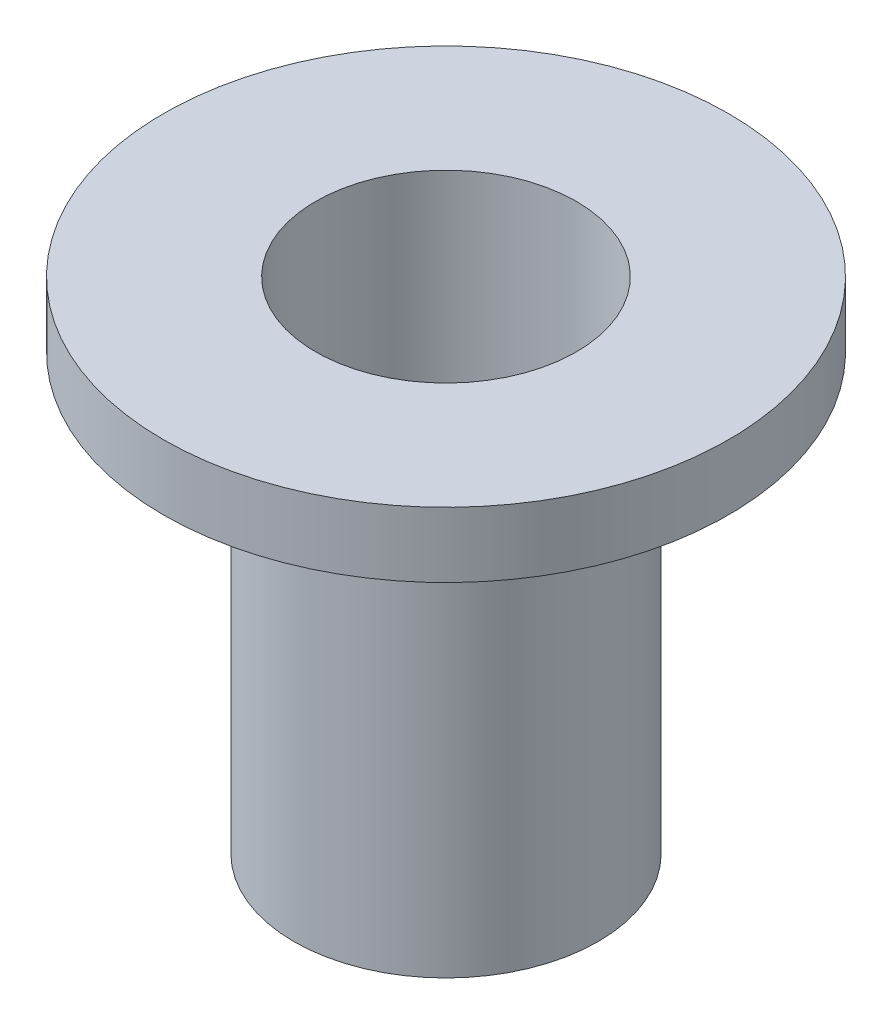
ISO-10303-21;
HEADER;
FILE_DESCRIPTION(('STEP AP214'),'2;1');
FILE_NAME('part.step','',(''),(''),'','','');
FILE_SCHEMA(('AUTOMOTIVE_DESIGN { 1 0 10303 214 1 1 1 1 }'));
ENDSEC;
DATA;
#1=APPLICATION_CONTEXT('core data for automotive mechanical design processes');
#2=APPLICATION_PROTOCOL_DEFINITION('international standard','automotive_design',2000,#1);
#3=PRODUCT_CONTEXT('',#1,'mechanical');
#4=PRODUCT('Part','Part','',(#3));
#5=PRODUCT_RELATED_PRODUCT_CATEGORY('part','',(#4));
#6=PRODUCT_DEFINITION_FORMATION('','',#4);
#7=PRODUCT_DEFINITION_CONTEXT('part definition',#1,'design');
#8=PRODUCT_DEFINITION('design','',#6,#7);
#9=PRODUCT_DEFINITION_SHAPE('','',#8);
#10=(LENGTH_UNIT() NAMED_UNIT(*) SI_UNIT(.MILLI.,.METRE.));
#11=(NAMED_UNIT(*) PLANE_ANGLE_UNIT() SI_UNIT($,.RADIAN.));
#12=(NAMED_UNIT(*) SI_UNIT($,.STERADIAN.) SOLID_ANGLE_UNIT());
#13=UNCERTAINTY_MEASURE_WITH_UNIT(LENGTH_MEASURE(1.E-05),#10,'distance_accuracy_value','');
#14=(GEOMETRIC_REPRESENTATION_CONTEXT(3) GLOBAL_UNCERTAINTY_ASSIGNED_CONTEXT((#13)) GLOBAL_UNIT_ASSIGNED_CONTEXT((#10,
#11,#12)) REPRESENTATION_CONTEXT('',''));
#15=CARTESIAN_POINT('',(0.,0.,0.));
#16=DIRECTION('',(0.,0.,1.));
#17=DIRECTION('',(1.,0.,0.));
#18=AXIS2_PLACEMENT_3D('',#15,#16,#17);
#19=CARTESIAN_POINT('',(0.,0.,0.));
#20=DIRECTION('',(0.,-1.,0.));
#21=DIRECTION('',(0.,0.,-1.));
#22=AXIS2_PLACEMENT_3D('',#19,#20,#21);
#23=CYLINDRICAL_SURFACE('',#22,6.);
#24=CARTESIAN_POINT('',(0.,-3.15384615384613,0.));
#25=DIRECTION('',(0.,-1.,0.));
#26=DIRECTION('',(0.,0.,-1.));
#27=AXIS2_PLACEMENT_3D('',#24,#25,#26);
#28=CIRCLE('',#27,6.);
#29=CARTESIAN_POINT('',(0.,-3.15384615384613,-6.));
#30=VERTEX_POINT('',#29);
#31=EDGE_CURVE('E10',#30,#30,#28,.T.);
#32=ORIENTED_EDGE('',*,*,#31,.T.);
#33=EDGE_LOOP('',(#32));
#34=FACE_BOUND('',#33,.T.);
#35=CARTESIAN_POINT('',(0.,19.8461538461539,0.));
#36=DIRECTION('',(0.,-1.,0.));
#37=DIRECTION('',(0.,0.,-1.));
#38=AXIS2_PLACEMENT_3D('',#35,#36,#37);
#39=CIRCLE('',#38,6.);
#40=CARTESIAN_POINT('',(0.,19.8461538461539,-6.));
#41=VERTEX_POINT('',#40);
#42=EDGE_CURVE('E59',#41,#41,#39,.T.);
#43=ORIENTED_EDGE('',*,*,#42,.F.);
#44=EDGE_LOOP('',(#43));
#45=FACE_BOUND('',#44,.T.);
#46=ADVANCED_FACE('F37',(#34,#45),#23,.F.);
#47=CARTESIAN_POINT('',(6.,-3.15384615384613,0.));
#48=DIRECTION('',(0.,-1.,0.));
#49=DIRECTION('',(0.,0.,-1.));
#50=AXIS2_PLACEMENT_3D('',#47,#48,#49);
#51=PLANE('',#50);
#52=CARTESIAN_POINT('',(0.,-3.15384615384613,0.));
#53=DIRECTION('',(0.,-1.,0.));
#54=DIRECTION('',(0.,0.,-1.));
#55=AXIS2_PLACEMENT_3D('',#52,#53,#54);
#56=CIRCLE('',#55,7.);
#57=CARTESIAN_POINT('',(0.,-3.15384615384613,-7.));
#58=VERTEX_POINT('',#57);
#59=EDGE_CURVE('E43',#58,#58,#56,.T.);
#60=ORIENTED_EDGE('',*,*,#59,.T.);
#61=EDGE_LOOP('',(#60));
#62=FACE_BOUND('',#61,.T.);
#63=ORIENTED_EDGE('',*,*,#31,.F.);
#64=EDGE_LOOP('',(#63));
#65=FACE_BOUND('',#64,.T.);
#66=ADVANCED_FACE('F67',(#62,#65),#51,.T.);
#67=CARTESIAN_POINT('',(0.,0.,0.));
#68=DIRECTION('',(0.,-1.,0.));
#69=DIRECTION('',(0.,0.,-1.));
#70=AXIS2_PLACEMENT_3D('',#67,#68,#69);
#71=CYLINDRICAL_SURFACE('',#70,7.);
#72=CARTESIAN_POINT('',(0.,16.8461538461539,0.));
#73=DIRECTION('',(0.,-1.,0.));
#74=DIRECTION('',(0.,0.,-1.));
#75=AXIS2_PLACEMENT_3D('',#72,#73,#74);
#76=CIRCLE('',#75,7.);
#77=CARTESIAN_POINT('',(0.,16.8461538461539,-7.));
#78=VERTEX_POINT('',#77);
#79=EDGE_CURVE('E47',#78,#78,#76,.T.);
#80=ORIENTED_EDGE('',*,*,#79,.T.);
#81=EDGE_LOOP('',(#80));
#82=FACE_BOUND('',#81,.T.);
#83=ORIENTED_EDGE('',*,*,#59,.F.);
#84=EDGE_LOOP('',(#83));
#85=FACE_BOUND('',#84,.T.);
#86=ADVANCED_FACE('F71',(#82,#85),#71,.T.);
#87=CARTESIAN_POINT('',(7.,16.8461538461539,0.));
#88=DIRECTION('',(0.,-1.,0.));
#89=DIRECTION('',(0.,0.,-1.));
#90=AXIS2_PLACEMENT_3D('',#87,#88,#89);
#91=PLANE('',#90);
#92=CARTESIAN_POINT('',(0.,16.8461538461539,0.));
#93=DIRECTION('',(0.,-1.,0.));
#94=DIRECTION('',(0.,0.,-1.));
#95=AXIS2_PLACEMENT_3D('',#92,#93,#94);
#96=CIRCLE('',#95,13.);
#97=CARTESIAN_POINT('',(0.,16.8461538461539,-13.));
#98=VERTEX_POINT('',#97);
#99=EDGE_CURVE('E51',#98,#98,#96,.T.);
#100=ORIENTED_EDGE('',*,*,#99,.T.);
#101=EDGE_LOOP('',(#100));
#102=FACE_BOUND('',#101,.T.);
#103=ORIENTED_EDGE('',*,*,#79,.F.);
#104=EDGE_LOOP('',(#103));
#105=FACE_BOUND('',#104,.T.);
#106=ADVANCED_FACE('F75',(#102,#105),#91,.T.);
#107=CARTESIAN_POINT('',(0.,0.,0.));
#108=DIRECTION('',(0.,-1.,0.));
#109=DIRECTION('',(0.,0.,-1.));
#110=AXIS2_PLACEMENT_3D('',#107,#108,#109);
#111=CYLINDRICAL_SURFACE('',#110,13.);
#112=CARTESIAN_POINT('',(0.,19.8461538461539,0.));
#113=DIRECTION('',(0.,-1.,0.));
#114=DIRECTION('',(0.,0.,-1.));
#115=AXIS2_PLACEMENT_3D('',#112,#113,#114);
#116=CIRCLE('',#115,13.);
#117=CARTESIAN_POINT('',(0.,19.8461538461539,-13.));
#118=VERTEX_POINT('',#117);
#119=EDGE_CURVE('E56',#118,#118,#116,.T.);
#120=ORIENTED_EDGE('',*,*,#119,.T.);
#121=EDGE_LOOP('',(#120));
#122=FACE_BOUND('',#121,.T.);
#123=ORIENTED_EDGE('',*,*,#99,.F.);
#124=EDGE_LOOP('',(#123));
#125=FACE_BOUND('',#124,.T.);
#126=ADVANCED_FACE('F82',(#122,#125),#111,.T.);
#127=CARTESIAN_POINT('',(13.,19.8461538461539,0.));
#128=DIRECTION('',(0.,1.,0.));
#129=DIRECTION('',(0.,0.,1.));
#130=AXIS2_PLACEMENT_3D('',#127,#128,#129);
#131=PLANE('',#130);
#132=ORIENTED_EDGE('',*,*,#42,.T.);
#133=EDGE_LOOP('',(#132));
#134=FACE_BOUND('',#133,.T.);
#135=ORIENTED_EDGE('',*,*,#119,.F.);
#136=EDGE_LOOP('',(#135));
#137=FACE_BOUND('',#136,.T.);
#138=ADVANCED_FACE('F63',(#134,#137),#131,.T.);
#139=CLOSED_SHELL('',(#46,#66,#86,#106,#126,#138));
#140=MANIFOLD_SOLID_BREP('B2',#139);
#141=ADVANCED_BREP_SHAPE_REPRESENTATION('',(#18,#140),#14);
#142=SHAPE_DEFINITION_REPRESENTATION(#9,#141);
ENDSEC;
END-ISO-10303-21;
